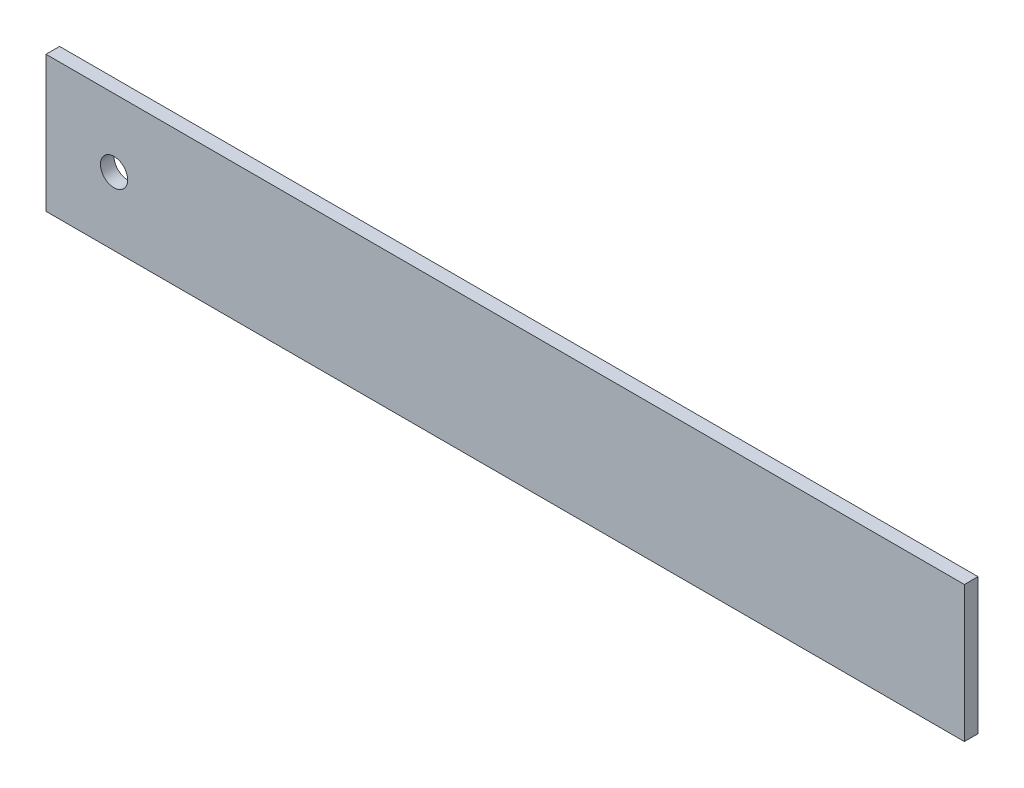
ISO-10303-21;
HEADER;
FILE_DESCRIPTION(('STEP AP214'),'2;1');
FILE_NAME('part.step','',(''),(''),'','','');
FILE_SCHEMA(('AUTOMOTIVE_DESIGN { 1 0 10303 214 1 1 1 1 }'));
ENDSEC;
DATA;
#1=APPLICATION_CONTEXT('core data for automotive mechanical design processes');
#2=APPLICATION_PROTOCOL_DEFINITION('international standard','automotive_design',2000,#1);
#3=PRODUCT_CONTEXT('',#1,'mechanical');
#4=PRODUCT('Part','Part','',(#3));
#5=PRODUCT_RELATED_PRODUCT_CATEGORY('part','',(#4));
#6=PRODUCT_DEFINITION_FORMATION('','',#4);
#7=PRODUCT_DEFINITION_CONTEXT('part definition',#1,'design');
#8=PRODUCT_DEFINITION('design','',#6,#7);
#9=PRODUCT_DEFINITION_SHAPE('','',#8);
#10=(LENGTH_UNIT() NAMED_UNIT(*) SI_UNIT(.MILLI.,.METRE.));
#11=(NAMED_UNIT(*) PLANE_ANGLE_UNIT() SI_UNIT($,.RADIAN.));
#12=(NAMED_UNIT(*) SI_UNIT($,.STERADIAN.) SOLID_ANGLE_UNIT());
#13=UNCERTAINTY_MEASURE_WITH_UNIT(LENGTH_MEASURE(1.E-05),#10,'distance_accuracy_value','');
#14=(GEOMETRIC_REPRESENTATION_CONTEXT(3) GLOBAL_UNCERTAINTY_ASSIGNED_CONTEXT((#13)) GLOBAL_UNIT_ASSIGNED_CONTEXT((#10,
#11,#12)) REPRESENTATION_CONTEXT('',''));
#15=CARTESIAN_POINT('',(0.,0.,0.));
#16=DIRECTION('',(0.,0.,1.));
#17=DIRECTION('',(1.,0.,0.));
#18=AXIS2_PLACEMENT_3D('',#15,#16,#17);
#19=CARTESIAN_POINT('',(0.,0.,2.));
#20=DIRECTION('',(1.,0.,0.));
#21=DIRECTION('',(0.,0.,-1.));
#22=AXIS2_PLACEMENT_3D('',#19,#20,#21);
#23=PLANE('',#22);
#24=DIRECTION('',(0.,-1.,0.));
#25=VECTOR('',#24,1.);
#26=CARTESIAN_POINT('',(0.,0.,0.));
#27=LINE('',#26,#25);
#28=CARTESIAN_POINT('',(0.,20.,0.));
#29=VERTEX_POINT('',#28);
#30=CARTESIAN_POINT('',(0.,0.,0.));
#31=VERTEX_POINT('',#30);
#32=EDGE_CURVE('E108',#29,#31,#27,.T.);
#33=ORIENTED_EDGE('',*,*,#32,.T.);
#34=DIRECTION('',(0.,0.,-1.));
#35=VECTOR('',#34,1.);
#36=CARTESIAN_POINT('',(0.,0.,2.));
#37=LINE('',#36,#35);
#38=CARTESIAN_POINT('',(0.,0.,2.));
#39=VERTEX_POINT('',#38);
#40=EDGE_CURVE('E13',#39,#31,#37,.T.);
#41=ORIENTED_EDGE('',*,*,#40,.F.);
#42=DIRECTION('',(0.,-1.,0.));
#43=VECTOR('',#42,1.);
#44=CARTESIAN_POINT('',(0.,0.,2.));
#45=LINE('',#44,#43);
#46=CARTESIAN_POINT('',(0.,20.,2.));
#47=VERTEX_POINT('',#46);
#48=EDGE_CURVE('E96',#47,#39,#45,.T.);
#49=ORIENTED_EDGE('',*,*,#48,.F.);
#50=DIRECTION('',(0.,0.,-1.));
#51=VECTOR('',#50,1.);
#52=CARTESIAN_POINT('',(0.,20.,2.));
#53=LINE('',#52,#51);
#54=EDGE_CURVE('E104',#47,#29,#53,.T.);
#55=ORIENTED_EDGE('',*,*,#54,.T.);
#56=EDGE_LOOP('',(#33,#41,#49,#55));
#57=FACE_BOUND('',#56,.T.);
#58=ADVANCED_FACE('F45',(#57),#23,.F.);
#59=CARTESIAN_POINT('',(0.,0.,2.));
#60=DIRECTION('',(0.,1.,0.));
#61=DIRECTION('',(0.,0.,1.));
#62=AXIS2_PLACEMENT_3D('',#59,#60,#61);
#63=PLANE('',#62);
#64=DIRECTION('',(1.,0.,0.));
#65=VECTOR('',#64,1.);
#66=CARTESIAN_POINT('',(0.,0.,0.));
#67=LINE('',#66,#65);
#68=CARTESIAN_POINT('',(135.,0.,0.));
#69=VERTEX_POINT('',#68);
#70=EDGE_CURVE('E100',#31,#69,#67,.T.);
#71=ORIENTED_EDGE('',*,*,#70,.T.);
#72=DIRECTION('',(0.,0.,-1.));
#73=VECTOR('',#72,1.);
#74=CARTESIAN_POINT('',(135.,0.,2.));
#75=LINE('',#74,#73);
#76=CARTESIAN_POINT('',(135.,0.,2.));
#77=VERTEX_POINT('',#76);
#78=EDGE_CURVE('E53',#77,#69,#75,.T.);
#79=ORIENTED_EDGE('',*,*,#78,.F.);
#80=DIRECTION('',(1.,0.,0.));
#81=VECTOR('',#80,1.);
#82=CARTESIAN_POINT('',(0.,0.,2.));
#83=LINE('',#82,#81);
#84=EDGE_CURVE('E91',#39,#77,#83,.T.);
#85=ORIENTED_EDGE('',*,*,#84,.F.);
#86=ORIENTED_EDGE('',*,*,#40,.T.);
#87=EDGE_LOOP('',(#71,#79,#85,#86));
#88=FACE_BOUND('',#87,.T.);
#89=ADVANCED_FACE('F99',(#88),#63,.F.);
#90=CARTESIAN_POINT('',(135.,0.,2.));
#91=DIRECTION('',(-1.,0.,0.));
#92=DIRECTION('',(0.,0.,1.));
#93=AXIS2_PLACEMENT_3D('',#90,#91,#92);
#94=PLANE('',#93);
#95=DIRECTION('',(0.,1.,0.));
#96=VECTOR('',#95,1.);
#97=CARTESIAN_POINT('',(135.,0.,0.));
#98=LINE('',#97,#96);
#99=CARTESIAN_POINT('',(135.,20.,0.));
#100=VERTEX_POINT('',#99);
#101=EDGE_CURVE('E78',#69,#100,#98,.T.);
#102=ORIENTED_EDGE('',*,*,#101,.T.);
#103=DIRECTION('',(0.,0.,-1.));
#104=VECTOR('',#103,1.);
#105=CARTESIAN_POINT('',(135.,20.,2.));
#106=LINE('',#105,#104);
#107=CARTESIAN_POINT('',(135.,20.,2.));
#108=VERTEX_POINT('',#107);
#109=EDGE_CURVE('E101',#108,#100,#106,.T.);
#110=ORIENTED_EDGE('',*,*,#109,.F.);
#111=DIRECTION('',(0.,1.,0.));
#112=VECTOR('',#111,1.);
#113=CARTESIAN_POINT('',(135.,0.,2.));
#114=LINE('',#113,#112);
#115=EDGE_CURVE('E94',#77,#108,#114,.T.);
#116=ORIENTED_EDGE('',*,*,#115,.F.);
#117=ORIENTED_EDGE('',*,*,#78,.T.);
#118=EDGE_LOOP('',(#102,#110,#116,#117));
#119=FACE_BOUND('',#118,.T.);
#120=ADVANCED_FACE('F102',(#119),#94,.F.);
#121=CARTESIAN_POINT('',(0.,20.,2.));
#122=DIRECTION('',(0.,-1.,0.));
#123=DIRECTION('',(0.,0.,-1.));
#124=AXIS2_PLACEMENT_3D('',#121,#122,#123);
#125=PLANE('',#124);
#126=DIRECTION('',(-1.,0.,0.));
#127=VECTOR('',#126,1.);
#128=CARTESIAN_POINT('',(0.,20.,0.));
#129=LINE('',#128,#127);
#130=EDGE_CURVE('E84',#100,#29,#129,.T.);
#131=ORIENTED_EDGE('',*,*,#130,.T.);
#132=ORIENTED_EDGE('',*,*,#54,.F.);
#133=DIRECTION('',(-1.,0.,0.));
#134=VECTOR('',#133,1.);
#135=CARTESIAN_POINT('',(0.,20.,2.));
#136=LINE('',#135,#134);
#137=EDGE_CURVE('E61',#108,#47,#136,.T.);
#138=ORIENTED_EDGE('',*,*,#137,.F.);
#139=ORIENTED_EDGE('',*,*,#109,.T.);
#140=EDGE_LOOP('',(#131,#132,#138,#139));
#141=FACE_BOUND('',#140,.T.);
#142=ADVANCED_FACE('F116',(#141),#125,.F.);
#143=CARTESIAN_POINT('',(0.,0.,2.));
#144=DIRECTION('',(0.,0.,-1.));
#145=DIRECTION('',(-1.,0.,0.));
#146=AXIS2_PLACEMENT_3D('',#143,#144,#145);
#147=PLANE('',#146);
#148=CARTESIAN_POINT('',(10.,10.,2.));
#149=DIRECTION('',(0.,0.,1.));
#150=DIRECTION('',(1.,0.,0.));
#151=AXIS2_PLACEMENT_3D('',#148,#149,#150);
#152=CIRCLE('',#151,2.);
#153=CARTESIAN_POINT('',(12.,10.,2.));
#154=VERTEX_POINT('',#153);
#155=EDGE_CURVE('E122',#154,#154,#152,.T.);
#156=ORIENTED_EDGE('',*,*,#155,.F.);
#157=EDGE_LOOP('',(#156));
#158=FACE_BOUND('',#157,.T.);
#159=ORIENTED_EDGE('',*,*,#48,.T.);
#160=ORIENTED_EDGE('',*,*,#84,.T.);
#161=ORIENTED_EDGE('',*,*,#115,.T.);
#162=ORIENTED_EDGE('',*,*,#137,.T.);
#163=EDGE_LOOP('',(#159,#160,#161,#162));
#164=FACE_BOUND('',#163,.T.);
#165=ADVANCED_FACE('F92',(#158,#164),#147,.F.);
#166=CARTESIAN_POINT('',(0.,0.,0.));
#167=DIRECTION('',(0.,0.,-1.));
#168=DIRECTION('',(-1.,0.,0.));
#169=AXIS2_PLACEMENT_3D('',#166,#167,#168);
#170=PLANE('',#169);
#171=CARTESIAN_POINT('',(10.,10.,0.));
#172=DIRECTION('',(0.,0.,1.));
#173=DIRECTION('',(1.,0.,0.));
#174=AXIS2_PLACEMENT_3D('',#171,#172,#173);
#175=CIRCLE('',#174,2.);
#176=CARTESIAN_POINT('',(12.,10.,0.));
#177=VERTEX_POINT('',#176);
#178=EDGE_CURVE('E111',#177,#177,#175,.T.);
#179=ORIENTED_EDGE('',*,*,#178,.T.);
#180=EDGE_LOOP('',(#179));
#181=FACE_BOUND('',#180,.T.);
#182=ORIENTED_EDGE('',*,*,#32,.F.);
#183=ORIENTED_EDGE('',*,*,#130,.F.);
#184=ORIENTED_EDGE('',*,*,#101,.F.);
#185=ORIENTED_EDGE('',*,*,#70,.F.);
#186=EDGE_LOOP('',(#182,#183,#184,#185));
#187=FACE_BOUND('',#186,.T.);
#188=ADVANCED_FACE('F119',(#181,#187),#170,.T.);
#189=CARTESIAN_POINT('',(10.,10.,0.));
#190=DIRECTION('',(0.,0.,1.));
#191=DIRECTION('',(1.,0.,0.));
#192=AXIS2_PLACEMENT_3D('',#189,#190,#191);
#193=CYLINDRICAL_SURFACE('',#192,2.);
#194=ORIENTED_EDGE('',*,*,#178,.F.);
#195=EDGE_LOOP('',(#194));
#196=FACE_BOUND('',#195,.T.);
#197=ORIENTED_EDGE('',*,*,#155,.T.);
#198=EDGE_LOOP('',(#197));
#199=FACE_BOUND('',#198,.T.);
#200=ADVANCED_FACE('F129',(#196,#199),#193,.F.);
#201=CLOSED_SHELL('',(#58,#89,#120,#142,#165,#188,#200));
#202=MANIFOLD_SOLID_BREP('B2',#201);
#203=ADVANCED_BREP_SHAPE_REPRESENTATION('',(#18,#202),#14);
#204=SHAPE_DEFINITION_REPRESENTATION(#9,#203);
ENDSEC;
END-ISO-10303-21;
